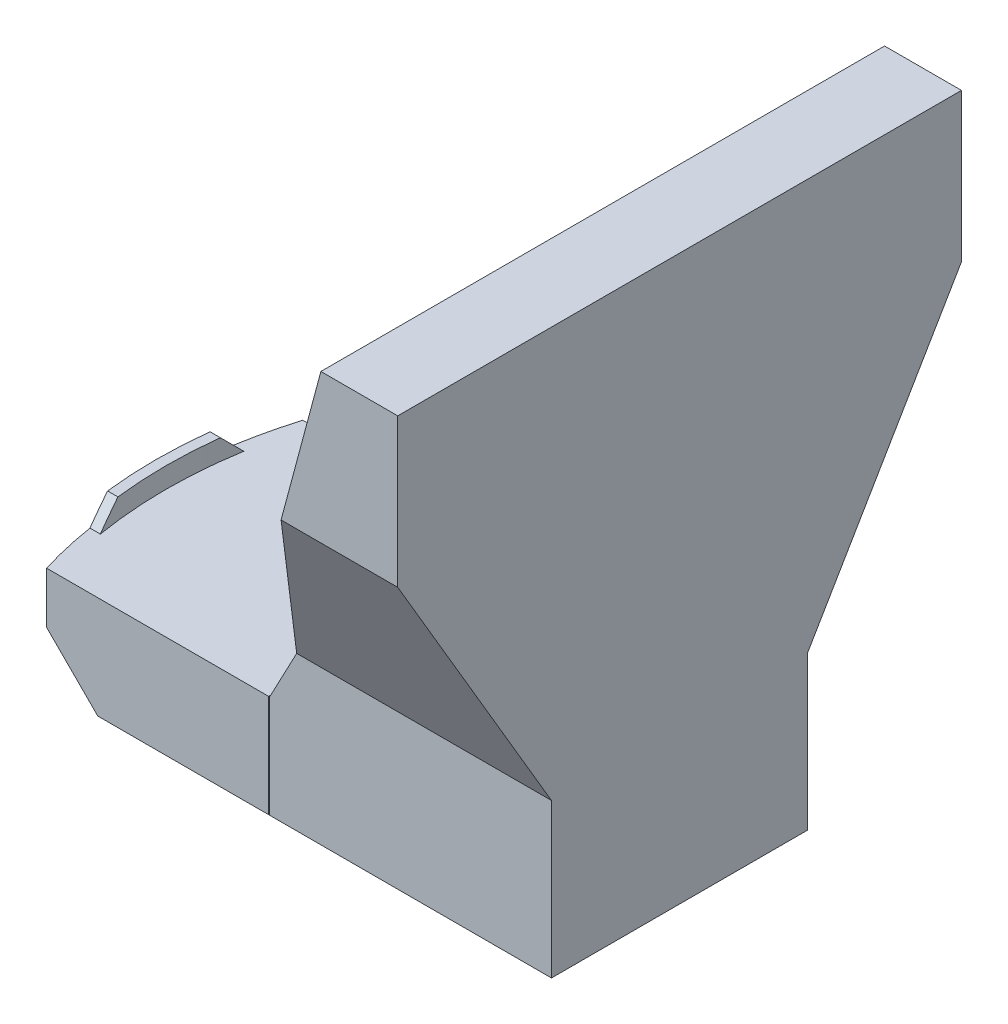
ISO-10303-21;
HEADER;
FILE_DESCRIPTION(('STEP AP214'),'2;1');
FILE_NAME('part.step','',(''),(''),'','','');
FILE_SCHEMA(('AUTOMOTIVE_DESIGN { 1 0 10303 214 1 1 1 1 }'));
ENDSEC;
DATA;
#1=APPLICATION_CONTEXT('core data for automotive mechanical design processes');
#2=APPLICATION_PROTOCOL_DEFINITION('international standard','automotive_design',2000,#1);
#3=PRODUCT_CONTEXT('',#1,'mechanical');
#4=PRODUCT('Part','Part','',(#3));
#5=PRODUCT_RELATED_PRODUCT_CATEGORY('part','',(#4));
#6=PRODUCT_DEFINITION_FORMATION('','',#4);
#7=PRODUCT_DEFINITION_CONTEXT('part definition',#1,'design');
#8=PRODUCT_DEFINITION('design','',#6,#7);
#9=PRODUCT_DEFINITION_SHAPE('','',#8);
#10=(LENGTH_UNIT() NAMED_UNIT(*) SI_UNIT(.MILLI.,.METRE.));
#11=(NAMED_UNIT(*) PLANE_ANGLE_UNIT() SI_UNIT($,.RADIAN.));
#12=(NAMED_UNIT(*) SI_UNIT($,.STERADIAN.) SOLID_ANGLE_UNIT());
#13=UNCERTAINTY_MEASURE_WITH_UNIT(LENGTH_MEASURE(1.E-05),#10,'distance_accuracy_value','');
#14=(GEOMETRIC_REPRESENTATION_CONTEXT(3) GLOBAL_UNCERTAINTY_ASSIGNED_CONTEXT((#13)) GLOBAL_UNIT_ASSIGNED_CONTEXT((#10,
#11,#12)) REPRESENTATION_CONTEXT('',''));
#15=CARTESIAN_POINT('',(0.,0.,0.));
#16=DIRECTION('',(0.,0.,1.));
#17=DIRECTION('',(1.,0.,0.));
#18=AXIS2_PLACEMENT_3D('',#15,#16,#17);
#19=CARTESIAN_POINT('',(78.0457127469454,110.,177.983738762488));
#20=DIRECTION('',(-1.,0.,0.));
#21=DIRECTION('',(0.,-1.,0.));
#22=AXIS2_PLACEMENT_3D('',#19,#20,#21);
#23=PLANE('',#22);
#24=DIRECTION('',(0.,1.,0.));
#25=VECTOR('',#24,1.);
#26=CARTESIAN_POINT('',(78.0457127469454,0.,-25.));
#27=LINE('',#26,#25);
#28=CARTESIAN_POINT('',(78.0457127469454,0.,-25.));
#29=VERTEX_POINT('',#28);
#30=CARTESIAN_POINT('',(78.0457127469454,30.,-25.));
#31=VERTEX_POINT('',#30);
#32=EDGE_CURVE('E119',#29,#31,#27,.T.);
#33=ORIENTED_EDGE('',*,*,#32,.T.);
#34=DIRECTION('',(0.,0.862030728946208,-0.50685601737818));
#35=VECTOR('',#34,1.);
#36=CARTESIAN_POINT('',(78.0457127469454,81.0222252113279,-55.));
#37=LINE('',#36,#35);
#38=CARTESIAN_POINT('',(78.0457127469454,81.0222252113279,-55.));
#39=VERTEX_POINT('',#38);
#40=EDGE_CURVE('E164',#31,#39,#37,.T.);
#41=ORIENTED_EDGE('',*,*,#40,.T.);
#42=DIRECTION('',(0.,-1.,0.));
#43=VECTOR('',#42,1.);
#44=CARTESIAN_POINT('',(78.0457127469454,110.,-55.));
#45=LINE('',#44,#43);
#46=CARTESIAN_POINT('',(78.0457127469454,110.,-55.));
#47=VERTEX_POINT('',#46);
#48=EDGE_CURVE('E172',#47,#39,#45,.T.);
#49=ORIENTED_EDGE('',*,*,#48,.F.);
#50=DIRECTION('',(0.,0.,-1.));
#51=VECTOR('',#50,1.);
#52=CARTESIAN_POINT('',(78.0457127469454,110.,177.983738762488));
#53=LINE('',#52,#51);
#54=CARTESIAN_POINT('',(78.0457127469454,110.,55.));
#55=VERTEX_POINT('',#54);
#56=EDGE_CURVE('E143',#55,#47,#53,.T.);
#57=ORIENTED_EDGE('',*,*,#56,.F.);
#58=DIRECTION('',(0.,-1.,0.));
#59=VECTOR('',#58,1.);
#60=CARTESIAN_POINT('',(78.0457127469454,110.,55.));
#61=LINE('',#60,#59);
#62=CARTESIAN_POINT('',(78.0457127469454,81.0222252113279,55.));
#63=VERTEX_POINT('',#62);
#64=EDGE_CURVE('E66',#55,#63,#61,.T.);
#65=ORIENTED_EDGE('',*,*,#64,.T.);
#66=DIRECTION('',(0.,0.862030728946208,0.50685601737818));
#67=VECTOR('',#66,1.);
#68=CARTESIAN_POINT('',(78.0457127469454,81.0222252113279,55.));
#69=LINE('',#68,#67);
#70=CARTESIAN_POINT('',(78.0457127469454,30.,25.));
#71=VERTEX_POINT('',#70);
#72=EDGE_CURVE('E59',#71,#63,#69,.T.);
#73=ORIENTED_EDGE('',*,*,#72,.F.);
#74=DIRECTION('',(0.,1.,0.));
#75=VECTOR('',#74,1.);
#76=CARTESIAN_POINT('',(78.0457127469454,0.,25.));
#77=LINE('',#76,#75);
#78=CARTESIAN_POINT('',(78.0457127469454,0.,25.));
#79=VERTEX_POINT('',#78);
#80=EDGE_CURVE('E193',#79,#71,#77,.T.);
#81=ORIENTED_EDGE('',*,*,#80,.F.);
#82=DIRECTION('',(0.,0.,-1.));
#83=VECTOR('',#82,1.);
#84=CARTESIAN_POINT('',(78.0457127469454,0.,177.983738762488));
#85=LINE('',#84,#83);
#86=EDGE_CURVE('E139',#79,#29,#85,.T.);
#87=ORIENTED_EDGE('',*,*,#86,.T.);
#88=EDGE_LOOP('',(#33,#41,#49,#57,#65,#73,#81,#87));
#89=FACE_BOUND('',#88,.T.);
#90=ADVANCED_FACE('F44',(#89),#23,.F.);
#91=CARTESIAN_POINT('',(78.0457127469454,0.,177.983738762488));
#92=DIRECTION('',(0.,1.,0.));
#93=DIRECTION('',(0.,0.,1.));
#94=AXIS2_PLACEMENT_3D('',#91,#92,#93);
#95=PLANE('',#94);
#96=DIRECTION('',(1.,0.,0.));
#97=VECTOR('',#96,1.);
#98=CARTESIAN_POINT('',(23.0457127469453,0.,-25.));
#99=LINE('',#98,#97);
#100=CARTESIAN_POINT('',(23.0457127469453,0.,-25.));
#101=VERTEX_POINT('',#100);
#102=EDGE_CURVE('E113',#101,#29,#99,.T.);
#103=ORIENTED_EDGE('',*,*,#102,.T.);
#104=ORIENTED_EDGE('',*,*,#86,.F.);
#105=DIRECTION('',(1.,0.,0.));
#106=VECTOR('',#105,1.);
#107=CARTESIAN_POINT('',(-24.1514294287429,0.,25.));
#108=LINE('',#107,#106);
#109=CARTESIAN_POINT('',(23.0457127469453,0.,25.));
#110=VERTEX_POINT('',#109);
#111=EDGE_CURVE('E138',#110,#79,#108,.T.);
#112=ORIENTED_EDGE('',*,*,#111,.F.);
#113=DIRECTION('',(0.,0.,-1.));
#114=VECTOR('',#113,1.);
#115=CARTESIAN_POINT('',(23.0457127469453,0.,177.983738762488));
#116=LINE('',#115,#114);
#117=EDGE_CURVE('E132',#110,#101,#116,.T.);
#118=ORIENTED_EDGE('',*,*,#117,.T.);
#119=EDGE_LOOP('',(#103,#104,#112,#118));
#120=FACE_BOUND('',#119,.T.);
#121=ADVANCED_FACE('F137',(#120),#95,.F.);
#122=CARTESIAN_POINT('',(23.0457127469453,20.,177.983738762488));
#123=DIRECTION('',(1.,0.,0.));
#124=DIRECTION('',(0.,1.,0.));
#125=AXIS2_PLACEMENT_3D('',#122,#123,#124);
#126=PLANE('',#125);
#127=DIRECTION('',(0.,1.,0.));
#128=VECTOR('',#127,1.);
#129=CARTESIAN_POINT('',(23.0457127469453,0.,-25.));
#130=LINE('',#129,#128);
#131=CARTESIAN_POINT('',(23.0457127469453,20.,-25.));
#132=VERTEX_POINT('',#131);
#133=EDGE_CURVE('E116',#101,#132,#130,.T.);
#134=ORIENTED_EDGE('',*,*,#133,.F.);
#135=ORIENTED_EDGE('',*,*,#117,.F.);
#136=DIRECTION('',(0.,1.,0.));
#137=VECTOR('',#136,1.);
#138=CARTESIAN_POINT('',(23.0457127469453,20.,25.));
#139=LINE('',#138,#137);
#140=CARTESIAN_POINT('',(23.0457127469453,20.,25.));
#141=VERTEX_POINT('',#140);
#142=EDGE_CURVE('E178',#110,#141,#139,.T.);
#143=ORIENTED_EDGE('',*,*,#142,.T.);
#144=DIRECTION('',(0.,0.,-1.));
#145=VECTOR('',#144,1.);
#146=CARTESIAN_POINT('',(23.0457127469453,20.,177.983738762488));
#147=LINE('',#146,#145);
#148=EDGE_CURVE('E134',#141,#132,#147,.T.);
#149=ORIENTED_EDGE('',*,*,#148,.T.);
#150=EDGE_LOOP('',(#134,#135,#143,#149));
#151=FACE_BOUND('',#150,.T.);
#152=ADVANCED_FACE('F130',(#151),#126,.F.);
#153=CARTESIAN_POINT('',(55.28114139387,81.0222252113279,177.983738762488));
#154=DIRECTION('',(0.884209710262989,-0.46709012864397,0.));
#155=DIRECTION('',(0.46709012864397,0.884209710262989,0.));
#156=AXIS2_PLACEMENT_3D('',#153,#154,#155);
#157=PLANE('',#156);
#158=DIRECTION('',(0.46709012864397,0.884209710262989,0.));
#159=VECTOR('',#158,1.);
#160=CARTESIAN_POINT('',(55.28114139387,81.0222252113279,-25.));
#161=LINE('',#160,#159);
#162=CARTESIAN_POINT('',(28.3282845534124,30.,-25.));
#163=VERTEX_POINT('',#162);
#164=EDGE_CURVE('E12',#132,#163,#161,.T.);
#165=ORIENTED_EDGE('',*,*,#164,.F.);
#166=ORIENTED_EDGE('',*,*,#148,.F.);
#167=DIRECTION('',(0.46709012864397,0.884209710262989,0.));
#168=VECTOR('',#167,1.);
#169=CARTESIAN_POINT('',(55.28114139387,81.0222252113279,25.));
#170=LINE('',#169,#168);
#171=CARTESIAN_POINT('',(28.3282845534124,30.,25.));
#172=VERTEX_POINT('',#171);
#173=EDGE_CURVE('E155',#141,#172,#170,.T.);
#174=ORIENTED_EDGE('',*,*,#173,.T.);
#175=DIRECTION('',(0.414427715659653,0.784518849610899,0.461280655456431));
#176=VECTOR('',#175,1.);
#177=CARTESIAN_POINT('',(78.7916338371498,125.527994947383,81.1684606375263));
#178=LINE('',#177,#176);
#179=CARTESIAN_POINT('',(55.2811413938699,81.0222252113279,55.));
#180=VERTEX_POINT('',#179);
#181=EDGE_CURVE('E182',#172,#180,#178,.T.);
#182=ORIENTED_EDGE('',*,*,#181,.T.);
#183=DIRECTION('',(0.,0.,-1.));
#184=VECTOR('',#183,1.);
#185=CARTESIAN_POINT('',(55.28114139387,81.0222252113279,177.983738762488));
#186=LINE('',#185,#184);
#187=CARTESIAN_POINT('',(55.28114139387,81.0222252113279,-55.));
#188=VERTEX_POINT('',#187);
#189=EDGE_CURVE('E141',#180,#188,#186,.T.);
#190=ORIENTED_EDGE('',*,*,#189,.T.);
#191=DIRECTION('',(0.414427715659653,0.784518849610899,-0.461280655456431));
#192=VECTOR('',#191,1.);
#193=CARTESIAN_POINT('',(10.7422252355226,-3.2907151330351,-5.42575662165906));
#194=LINE('',#193,#192);
#195=EDGE_CURVE('E124',#163,#188,#194,.T.);
#196=ORIENTED_EDGE('',*,*,#195,.F.);
#197=EDGE_LOOP('',(#165,#166,#174,#182,#190,#196));
#198=FACE_BOUND('',#197,.T.);
#199=ADVANCED_FACE('F203',(#198),#157,.F.);
#200=CARTESIAN_POINT('',(62.8485705712571,110.,-55.));
#201=DIRECTION('',(0.,0.,1.));
#202=DIRECTION('',(1.,0.,0.));
#203=AXIS2_PLACEMENT_3D('',#200,#201,#202);
#204=PLANE('',#203);
#205=DIRECTION('',(1.,0.,0.));
#206=VECTOR('',#205,1.);
#207=CARTESIAN_POINT('',(62.8485705712571,81.022225211328,-55.));
#208=LINE('',#207,#206);
#209=EDGE_CURVE('E52',#188,#39,#208,.T.);
#210=ORIENTED_EDGE('',*,*,#209,.F.);
#211=DIRECTION('',(0.258819045102514,0.96592582628907,0.));
#212=VECTOR('',#211,1.);
#213=CARTESIAN_POINT('',(63.0457127469454,110.,-55.));
#214=LINE('',#213,#212);
#215=CARTESIAN_POINT('',(63.0457127469454,110.,-55.));
#216=VERTEX_POINT('',#215);
#217=EDGE_CURVE('E180',#188,#216,#214,.T.);
#218=ORIENTED_EDGE('',*,*,#217,.T.);
#219=DIRECTION('',(1.,0.,0.));
#220=VECTOR('',#219,1.);
#221=CARTESIAN_POINT('',(78.0457127469454,110.,-55.));
#222=LINE('',#221,#220);
#223=EDGE_CURVE('E177',#216,#47,#222,.T.);
#224=ORIENTED_EDGE('',*,*,#223,.T.);
#225=ORIENTED_EDGE('',*,*,#48,.T.);
#226=EDGE_LOOP('',(#210,#218,#224,#225));
#227=FACE_BOUND('',#226,.T.);
#228=ADVANCED_FACE('F175',(#227),#204,.F.);
#229=CARTESIAN_POINT('',(63.0457127469454,110.,177.983738762488));
#230=DIRECTION('',(0.96592582628907,-0.258819045102514,0.));
#231=DIRECTION('',(0.258819045102514,0.96592582628907,0.));
#232=AXIS2_PLACEMENT_3D('',#229,#230,#231);
#233=PLANE('',#232);
#234=ORIENTED_EDGE('',*,*,#189,.F.);
#235=DIRECTION('',(0.258819045102514,0.96592582628907,0.));
#236=VECTOR('',#235,1.);
#237=CARTESIAN_POINT('',(63.0457127469454,110.,55.));
#238=LINE('',#237,#236);
#239=CARTESIAN_POINT('',(63.0457127469454,110.,55.));
#240=VERTEX_POINT('',#239);
#241=EDGE_CURVE('E152',#180,#240,#238,.T.);
#242=ORIENTED_EDGE('',*,*,#241,.T.);
#243=DIRECTION('',(0.,0.,-1.));
#244=VECTOR('',#243,1.);
#245=CARTESIAN_POINT('',(63.0457127469454,110.,177.983738762488));
#246=LINE('',#245,#244);
#247=EDGE_CURVE('E149',#240,#216,#246,.T.);
#248=ORIENTED_EDGE('',*,*,#247,.T.);
#249=ORIENTED_EDGE('',*,*,#217,.F.);
#250=EDGE_LOOP('',(#234,#242,#248,#249));
#251=FACE_BOUND('',#250,.T.);
#252=ADVANCED_FACE('F209',(#251),#233,.F.);
#253=CARTESIAN_POINT('',(78.0457127469454,110.,177.983738762488));
#254=DIRECTION('',(0.,-1.,0.));
#255=DIRECTION('',(0.,0.,-1.));
#256=AXIS2_PLACEMENT_3D('',#253,#254,#255);
#257=PLANE('',#256);
#258=ORIENTED_EDGE('',*,*,#247,.F.);
#259=DIRECTION('',(1.,0.,0.));
#260=VECTOR('',#259,1.);
#261=CARTESIAN_POINT('',(78.0457127469454,110.,55.));
#262=LINE('',#261,#260);
#263=EDGE_CURVE('E156',#240,#55,#262,.T.);
#264=ORIENTED_EDGE('',*,*,#263,.T.);
#265=ORIENTED_EDGE('',*,*,#56,.T.);
#266=ORIENTED_EDGE('',*,*,#223,.F.);
#267=EDGE_LOOP('',(#258,#264,#265,#266));
#268=FACE_BOUND('',#267,.T.);
#269=ADVANCED_FACE('F46',(#268),#257,.F.);
#270=CARTESIAN_POINT('',(62.8485705712571,110.,55.));
#271=DIRECTION('',(0.,0.,-1.));
#272=DIRECTION('',(-1.,0.,0.));
#273=AXIS2_PLACEMENT_3D('',#270,#271,#272);
#274=PLANE('',#273);
#275=ORIENTED_EDGE('',*,*,#241,.F.);
#276=DIRECTION('',(1.,0.,0.));
#277=VECTOR('',#276,1.);
#278=CARTESIAN_POINT('',(62.8485705712571,81.0222252113279,55.));
#279=LINE('',#278,#277);
#280=EDGE_CURVE('E153',#180,#63,#279,.T.);
#281=ORIENTED_EDGE('',*,*,#280,.T.);
#282=ORIENTED_EDGE('',*,*,#64,.F.);
#283=ORIENTED_EDGE('',*,*,#263,.F.);
#284=EDGE_LOOP('',(#275,#281,#282,#283));
#285=FACE_BOUND('',#284,.T.);
#286=ADVANCED_FACE('F207',(#285),#274,.F.);
#287=CARTESIAN_POINT('',(-24.1514294287429,0.,25.));
#288=DIRECTION('',(0.,0.,-1.));
#289=DIRECTION('',(-1.,0.,0.));
#290=AXIS2_PLACEMENT_3D('',#287,#288,#289);
#291=PLANE('',#290);
#292=ORIENTED_EDGE('',*,*,#111,.T.);
#293=ORIENTED_EDGE('',*,*,#80,.T.);
#294=DIRECTION('',(1.,0.,0.));
#295=VECTOR('',#294,1.);
#296=CARTESIAN_POINT('',(-24.1514294287429,30.,25.));
#297=LINE('',#296,#295);
#298=EDGE_CURVE('E195',#172,#71,#297,.T.);
#299=ORIENTED_EDGE('',*,*,#298,.F.);
#300=ORIENTED_EDGE('',*,*,#173,.F.);
#301=ORIENTED_EDGE('',*,*,#142,.F.);
#302=EDGE_LOOP('',(#292,#293,#299,#300,#301));
#303=FACE_BOUND('',#302,.T.);
#304=ADVANCED_FACE('F266',(#303),#291,.F.);
#305=CARTESIAN_POINT('',(-24.1514294287429,81.0222252113279,55.));
#306=DIRECTION('',(0.,0.50685601737818,-0.862030728946208));
#307=DIRECTION('',(0.,0.862030728946208,0.50685601737818));
#308=AXIS2_PLACEMENT_3D('',#305,#306,#307);
#309=PLANE('',#308);
#310=ORIENTED_EDGE('',*,*,#298,.T.);
#311=ORIENTED_EDGE('',*,*,#72,.T.);
#312=ORIENTED_EDGE('',*,*,#280,.F.);
#313=ORIENTED_EDGE('',*,*,#181,.F.);
#314=EDGE_LOOP('',(#310,#311,#312,#313));
#315=FACE_BOUND('',#314,.T.);
#316=ADVANCED_FACE('F250',(#315),#309,.F.);
#317=CARTESIAN_POINT('',(23.0457127469453,0.,-25.));
#318=DIRECTION('',(0.,0.,-1.));
#319=DIRECTION('',(-1.,0.,0.));
#320=AXIS2_PLACEMENT_3D('',#317,#318,#319);
#321=PLANE('',#320);
#322=ORIENTED_EDGE('',*,*,#164,.T.);
#323=DIRECTION('',(1.,0.,0.));
#324=VECTOR('',#323,1.);
#325=CARTESIAN_POINT('',(23.0457127469453,30.,-25.));
#326=LINE('',#325,#324);
#327=EDGE_CURVE('E125',#163,#31,#326,.T.);
#328=ORIENTED_EDGE('',*,*,#327,.T.);
#329=ORIENTED_EDGE('',*,*,#32,.F.);
#330=ORIENTED_EDGE('',*,*,#102,.F.);
#331=ORIENTED_EDGE('',*,*,#133,.T.);
#332=EDGE_LOOP('',(#322,#328,#329,#330,#331));
#333=FACE_BOUND('',#332,.T.);
#334=ADVANCED_FACE('F115',(#333),#321,.T.);
#335=CARTESIAN_POINT('',(23.0457127469453,81.0222252113279,-55.));
#336=DIRECTION('',(0.,-0.50685601737818,-0.862030728946208));
#337=DIRECTION('',(0.,0.862030728946208,-0.50685601737818));
#338=AXIS2_PLACEMENT_3D('',#335,#336,#337);
#339=PLANE('',#338);
#340=ORIENTED_EDGE('',*,*,#195,.T.);
#341=ORIENTED_EDGE('',*,*,#209,.T.);
#342=ORIENTED_EDGE('',*,*,#40,.F.);
#343=ORIENTED_EDGE('',*,*,#327,.F.);
#344=EDGE_LOOP('',(#340,#341,#342,#343));
#345=FACE_BOUND('',#344,.T.);
#346=ADVANCED_FACE('F162',(#345),#339,.T.);
#347=CLOSED_SHELL('',(#90,#121,#152,#199,#228,#252,#269,#286,#304,#316,#334,#346));
#348=MANIFOLD_SOLID_BREP('B2',#347);
#349=CARTESIAN_POINT('',(22.8485705712571,20.,-25.));
#350=DIRECTION('',(0.,0.,1.));
#351=DIRECTION('',(1.,0.,0.));
#352=AXIS2_PLACEMENT_3D('',#349,#350,#351);
#353=PLANE('',#352);
#354=DIRECTION('',(-1.,0.,0.));
#355=VECTOR('',#354,1.);
#356=CARTESIAN_POINT('',(22.8485705712571,0.,-25.));
#357=LINE('',#356,#355);
#358=CARTESIAN_POINT('',(22.8485705712571,0.,-25.));
#359=VERTEX_POINT('',#358);
#360=CARTESIAN_POINT('',(-10.4820960527415,0.,-25.));
#361=VERTEX_POINT('',#360);
#362=EDGE_CURVE('E424',#359,#361,#357,.T.);
#363=ORIENTED_EDGE('',*,*,#362,.T.);
#364=DIRECTION('',(-0.707106781186551,0.707106781186544,0.));
#365=VECTOR('',#364,1.);
#366=CARTESIAN_POINT('',(-10.4820960527415,0.,-25.));
#367=LINE('',#366,#365);
#368=CARTESIAN_POINT('',(-20.4820960527415,9.99999999999988,-25.));
#369=VERTEX_POINT('',#368);
#370=EDGE_CURVE('E414',#361,#369,#367,.T.);
#371=ORIENTED_EDGE('',*,*,#370,.T.);
#372=DIRECTION('',(0.,-1.,0.));
#373=VECTOR('',#372,1.);
#374=CARTESIAN_POINT('',(-20.4820960527415,20.,-25.));
#375=LINE('',#374,#373);
#376=CARTESIAN_POINT('',(-20.4820960527415,20.,-25.));
#377=VERTEX_POINT('',#376);
#378=EDGE_CURVE('E444',#377,#369,#375,.T.);
#379=ORIENTED_EDGE('',*,*,#378,.F.);
#380=DIRECTION('',(-1.,0.,0.));
#381=VECTOR('',#380,1.);
#382=CARTESIAN_POINT('',(22.8485705712571,20.,-25.));
#383=LINE('',#382,#381);
#384=CARTESIAN_POINT('',(22.8485705712571,20.,-25.));
#385=VERTEX_POINT('',#384);
#386=EDGE_CURVE('E398',#385,#377,#383,.T.);
#387=ORIENTED_EDGE('',*,*,#386,.F.);
#388=DIRECTION('',(0.,-1.,0.));
#389=VECTOR('',#388,1.);
#390=CARTESIAN_POINT('',(22.8485705712571,20.,-25.));
#391=LINE('',#390,#389);
#392=EDGE_CURVE('E430',#385,#359,#391,.T.);
#393=ORIENTED_EDGE('',*,*,#392,.T.);
#394=EDGE_LOOP('',(#363,#371,#379,#387,#393));
#395=FACE_BOUND('',#394,.T.);
#396=ADVANCED_FACE('F314',(#395),#353,.F.);
#397=CARTESIAN_POINT('',(62.8485705712571,20.,0.));
#398=DIRECTION('',(0.,-1.,0.));
#399=DIRECTION('',(0.,0.,-1.));
#400=AXIS2_PLACEMENT_3D('',#397,#398,#399);
#401=CYLINDRICAL_SURFACE('',#400,87.);
#402=CARTESIAN_POINT('',(62.8485705712571,24.,0.));
#403=DIRECTION('',(0.,1.,0.));
#404=DIRECTION('',(0.,0.,1.));
#405=AXIS2_PLACEMENT_3D('',#402,#403,#404);
#406=CIRCLE('',#405,87.);
#407=CARTESIAN_POINT('',(-23.5748058959928,24.,-10.));
#408=VERTEX_POINT('',#407);
#409=CARTESIAN_POINT('',(-23.5748058959928,24.,10.));
#410=VERTEX_POINT('',#409);
#411=EDGE_CURVE('E390',#408,#410,#406,.T.);
#412=ORIENTED_EDGE('',*,*,#411,.F.);
#413=CARTESIAN_POINT('',(62.8485705712571,34.,0.));
#414=DIRECTION('',(0.,0.707106781186546,-0.707106781186549));
#415=DIRECTION('',(0.,-0.707106781186549,-0.707106781186546));
#416=AXIS2_PLACEMENT_3D('',#413,#414,#415);
#417=ELLIPSE('',#416,123.03657992646,87.);
#418=CARTESIAN_POINT('',(-23.0176043755751,20.,-14.));
#419=VERTEX_POINT('',#418);
#420=EDGE_CURVE('E338',#408,#419,#417,.F.);
#421=ORIENTED_EDGE('',*,*,#420,.T.);
#422=CARTESIAN_POINT('',(62.8485705712571,20.,0.));
#423=DIRECTION('',(0.,1.,0.));
#424=DIRECTION('',(0.,0.,1.));
#425=AXIS2_PLACEMENT_3D('',#422,#423,#424);
#426=CIRCLE('',#425,87.);
#427=EDGE_CURVE('E388',#377,#419,#426,.T.);
#428=ORIENTED_EDGE('',*,*,#427,.F.);
#429=ORIENTED_EDGE('',*,*,#378,.T.);
#430=CARTESIAN_POINT('',(62.8485705712571,-73.3306666239979,0.));
#431=DIRECTION('',(0.707106781186544,0.707106781186551,0.));
#432=DIRECTION('',(0.707106781186551,-0.707106781186544,0.));
#433=AXIS2_PLACEMENT_3D('',#430,#431,#432);
#434=ELLIPSE('',#433,123.036579926459,87.);
#435=CARTESIAN_POINT('',(-20.4820960527415,9.99999999999989,25.));
#436=VERTEX_POINT('',#435);
#437=EDGE_CURVE('E421',#369,#436,#434,.T.);
#438=ORIENTED_EDGE('',*,*,#437,.T.);
#439=DIRECTION('',(0.,-1.,0.));
#440=VECTOR('',#439,1.);
#441=CARTESIAN_POINT('',(-20.4820960527415,20.,25.));
#442=LINE('',#441,#440);
#443=CARTESIAN_POINT('',(-20.4820960527415,20.,25.));
#444=VERTEX_POINT('',#443);
#445=EDGE_CURVE('E441',#444,#436,#442,.T.);
#446=ORIENTED_EDGE('',*,*,#445,.F.);
#447=CARTESIAN_POINT('',(-23.0176043755751,20.,14.));
#448=VERTEX_POINT('',#447);
#449=EDGE_CURVE('E401',#448,#444,#426,.T.);
#450=ORIENTED_EDGE('',*,*,#449,.F.);
#451=CARTESIAN_POINT('',(62.8485705712571,34.,0.));
#452=DIRECTION('',(0.,0.707106781186546,0.707106781186549));
#453=DIRECTION('',(0.,-0.707106781186549,0.707106781186546));
#454=AXIS2_PLACEMENT_3D('',#451,#452,#453);
#455=ELLIPSE('',#454,123.03657992646,87.);
#456=EDGE_CURVE('E330',#448,#410,#455,.F.);
#457=ORIENTED_EDGE('',*,*,#456,.T.);
#458=EDGE_LOOP('',(#412,#421,#428,#429,#438,#446,#450,#457));
#459=FACE_BOUND('',#458,.T.);
#460=ADVANCED_FACE('F386',(#459),#401,.T.);
#461=CARTESIAN_POINT('',(-20.4820960527415,20.,25.));
#462=DIRECTION('',(0.,0.,-1.));
#463=DIRECTION('',(-1.,0.,0.));
#464=AXIS2_PLACEMENT_3D('',#461,#462,#463);
#465=PLANE('',#464);
#466=ORIENTED_EDGE('',*,*,#445,.T.);
#467=DIRECTION('',(-0.707106781186551,0.707106781186544,0.));
#468=VECTOR('',#467,1.);
#469=CARTESIAN_POINT('',(-10.4820960527415,0.,25.));
#470=LINE('',#469,#468);
#471=CARTESIAN_POINT('',(-10.4820960527415,0.,25.));
#472=VERTEX_POINT('',#471);
#473=EDGE_CURVE('E418',#472,#436,#470,.T.);
#474=ORIENTED_EDGE('',*,*,#473,.F.);
#475=DIRECTION('',(1.,0.,0.));
#476=VECTOR('',#475,1.);
#477=CARTESIAN_POINT('',(-20.4820960527415,0.,25.));
#478=LINE('',#477,#476);
#479=CARTESIAN_POINT('',(22.8485705712571,0.,25.));
#480=VERTEX_POINT('',#479);
#481=EDGE_CURVE('E433',#472,#480,#478,.T.);
#482=ORIENTED_EDGE('',*,*,#481,.T.);
#483=DIRECTION('',(0.,-1.,0.));
#484=VECTOR('',#483,1.);
#485=CARTESIAN_POINT('',(22.8485705712571,20.,25.));
#486=LINE('',#485,#484);
#487=CARTESIAN_POINT('',(22.8485705712571,20.,25.));
#488=VERTEX_POINT('',#487);
#489=EDGE_CURVE('E438',#488,#480,#486,.T.);
#490=ORIENTED_EDGE('',*,*,#489,.F.);
#491=DIRECTION('',(1.,0.,0.));
#492=VECTOR('',#491,1.);
#493=CARTESIAN_POINT('',(-20.4820960527415,20.,25.));
#494=LINE('',#493,#492);
#495=EDGE_CURVE('E400',#444,#488,#494,.T.);
#496=ORIENTED_EDGE('',*,*,#495,.F.);
#497=EDGE_LOOP('',(#466,#474,#482,#490,#496));
#498=FACE_BOUND('',#497,.T.);
#499=ADVANCED_FACE('F474',(#498),#465,.F.);
#500=CARTESIAN_POINT('',(22.8485705712571,20.,15.));
#501=DIRECTION('',(-1.,0.,0.));
#502=DIRECTION('',(0.,0.,1.));
#503=AXIS2_PLACEMENT_3D('',#500,#501,#502);
#504=PLANE('',#503);
#505=DIRECTION('',(0.,0.,-1.));
#506=VECTOR('',#505,1.);
#507=CARTESIAN_POINT('',(22.8485705712571,0.,15.));
#508=LINE('',#507,#506);
#509=EDGE_CURVE('E425',#480,#359,#508,.T.);
#510=ORIENTED_EDGE('',*,*,#509,.T.);
#511=ORIENTED_EDGE('',*,*,#392,.F.);
#512=DIRECTION('',(0.,0.,-1.));
#513=VECTOR('',#512,1.);
#514=CARTESIAN_POINT('',(22.8485705712571,20.,25.));
#515=LINE('',#514,#513);
#516=EDGE_CURVE('E428',#488,#385,#515,.T.);
#517=ORIENTED_EDGE('',*,*,#516,.F.);
#518=ORIENTED_EDGE('',*,*,#489,.T.);
#519=EDGE_LOOP('',(#510,#511,#517,#518));
#520=FACE_BOUND('',#519,.T.);
#521=ADVANCED_FACE('F484',(#520),#504,.F.);
#522=CARTESIAN_POINT('',(62.8485705712571,20.,0.));
#523=DIRECTION('',(0.,1.,0.));
#524=DIRECTION('',(0.,0.,1.));
#525=AXIS2_PLACEMENT_3D('',#522,#523,#524);
#526=PLANE('',#525);
#527=DIRECTION('',(1.,0.,0.));
#528=VECTOR('',#527,1.);
#529=CARTESIAN_POINT('',(-23.0176043755751,20.,14.));
#530=LINE('',#529,#528);
#531=CARTESIAN_POINT('',(-20.9905611036356,20.,14.));
#532=VERTEX_POINT('',#531);
#533=EDGE_CURVE('E405',#448,#532,#530,.T.);
#534=ORIENTED_EDGE('',*,*,#533,.F.);
#535=ORIENTED_EDGE('',*,*,#449,.T.);
#536=ORIENTED_EDGE('',*,*,#495,.T.);
#537=ORIENTED_EDGE('',*,*,#516,.T.);
#538=ORIENTED_EDGE('',*,*,#386,.T.);
#539=ORIENTED_EDGE('',*,*,#427,.T.);
#540=DIRECTION('',(-1.,0.,0.));
#541=VECTOR('',#540,1.);
#542=CARTESIAN_POINT('',(-23.0176043755751,20.,-14.));
#543=LINE('',#542,#541);
#544=CARTESIAN_POINT('',(-20.9905611036356,20.,-14.));
#545=VERTEX_POINT('',#544);
#546=EDGE_CURVE('E395',#545,#419,#543,.T.);
#547=ORIENTED_EDGE('',*,*,#546,.F.);
#548=CARTESIAN_POINT('',(62.8485705712571,20.,0.));
#549=DIRECTION('',(0.,-1.,0.));
#550=DIRECTION('',(0.,0.,1.));
#551=AXIS2_PLACEMENT_3D('',#548,#549,#550);
#552=CIRCLE('',#551,85.);
#553=EDGE_CURVE('E406',#532,#545,#552,.T.);
#554=ORIENTED_EDGE('',*,*,#553,.F.);
#555=EDGE_LOOP('',(#534,#535,#536,#537,#538,#539,#547,#554));
#556=FACE_BOUND('',#555,.T.);
#557=ADVANCED_FACE('F393',(#556),#526,.T.);
#558=CARTESIAN_POINT('',(62.8485705712571,0.,0.));
#559=DIRECTION('',(0.,1.,0.));
#560=DIRECTION('',(0.,0.,1.));
#561=AXIS2_PLACEMENT_3D('',#558,#559,#560);
#562=PLANE('',#561);
#563=ORIENTED_EDGE('',*,*,#481,.F.);
#564=DIRECTION('',(0.,0.,1.));
#565=VECTOR('',#564,1.);
#566=CARTESIAN_POINT('',(-10.4820960527415,0.,-25.));
#567=LINE('',#566,#565);
#568=EDGE_CURVE('E417',#361,#472,#567,.T.);
#569=ORIENTED_EDGE('',*,*,#568,.F.);
#570=ORIENTED_EDGE('',*,*,#362,.F.);
#571=ORIENTED_EDGE('',*,*,#509,.F.);
#572=EDGE_LOOP('',(#563,#569,#570,#571));
#573=FACE_BOUND('',#572,.T.);
#574=ADVANCED_FACE('F489',(#573),#562,.F.);
#575=CARTESIAN_POINT('',(-10.4820960527415,0.,-25.));
#576=DIRECTION('',(0.707106781186544,0.707106781186551,0.));
#577=DIRECTION('',(-0.707106781186551,0.707106781186544,0.));
#578=AXIS2_PLACEMENT_3D('',#575,#576,#577);
#579=PLANE('',#578);
#580=ORIENTED_EDGE('',*,*,#370,.F.);
#581=ORIENTED_EDGE('',*,*,#568,.T.);
#582=ORIENTED_EDGE('',*,*,#473,.T.);
#583=ORIENTED_EDGE('',*,*,#437,.F.);
#584=EDGE_LOOP('',(#580,#581,#582,#583));
#585=FACE_BOUND('',#584,.T.);
#586=ADVANCED_FACE('F466',(#585),#579,.F.);
#587=CARTESIAN_POINT('',(62.8485705712571,24.,0.));
#588=DIRECTION('',(0.,-1.,0.));
#589=DIRECTION('',(0.,0.,-1.));
#590=AXIS2_PLACEMENT_3D('',#587,#588,#589);
#591=CYLINDRICAL_SURFACE('',#590,85.);
#592=ORIENTED_EDGE('',*,*,#553,.T.);
#593=CARTESIAN_POINT('',(62.8485705712571,34.,0.));
#594=DIRECTION('',(0.,0.707106781186546,-0.707106781186549));
#595=DIRECTION('',(0.,-0.707106781186549,-0.707106781186546));
#596=AXIS2_PLACEMENT_3D('',#593,#594,#595);
#597=ELLIPSE('',#596,120.208152801713,85.);
#598=CARTESIAN_POINT('',(-21.5611445094136,24.,-10.));
#599=VERTEX_POINT('',#598);
#600=EDGE_CURVE('E42',#545,#599,#597,.T.);
#601=ORIENTED_EDGE('',*,*,#600,.T.);
#602=CARTESIAN_POINT('',(62.8485705712571,24.,0.));
#603=DIRECTION('',(0.,-1.,0.));
#604=DIRECTION('',(0.,0.,1.));
#605=AXIS2_PLACEMENT_3D('',#602,#603,#604);
#606=CIRCLE('',#605,85.);
#607=CARTESIAN_POINT('',(-21.5611445094136,24.,10.));
#608=VERTEX_POINT('',#607);
#609=EDGE_CURVE('E409',#608,#599,#606,.T.);
#610=ORIENTED_EDGE('',*,*,#609,.F.);
#611=CARTESIAN_POINT('',(62.8485705712571,34.,0.));
#612=DIRECTION('',(0.,0.707106781186546,0.707106781186549));
#613=DIRECTION('',(0.,-0.707106781186549,0.707106781186546));
#614=AXIS2_PLACEMENT_3D('',#611,#612,#613);
#615=ELLIPSE('',#614,120.208152801713,85.);
#616=EDGE_CURVE('E323',#608,#532,#615,.T.);
#617=ORIENTED_EDGE('',*,*,#616,.T.);
#618=EDGE_LOOP('',(#592,#601,#610,#617));
#619=FACE_BOUND('',#618,.T.);
#620=ADVANCED_FACE('F453',(#619),#591,.F.);
#621=CARTESIAN_POINT('',(62.8485705712571,24.,0.));
#622=DIRECTION('',(0.,1.,0.));
#623=DIRECTION('',(0.,0.,1.));
#624=AXIS2_PLACEMENT_3D('',#621,#622,#623);
#625=PLANE('',#624);
#626=ORIENTED_EDGE('',*,*,#609,.T.);
#627=DIRECTION('',(-1.,0.,0.));
#628=VECTOR('',#627,1.);
#629=CARTESIAN_POINT('',(-23.0176043755751,24.,-10.));
#630=LINE('',#629,#628);
#631=EDGE_CURVE('E449',#599,#408,#630,.T.);
#632=ORIENTED_EDGE('',*,*,#631,.T.);
#633=ORIENTED_EDGE('',*,*,#411,.T.);
#634=DIRECTION('',(1.,0.,0.));
#635=VECTOR('',#634,1.);
#636=CARTESIAN_POINT('',(-20.9905611036356,24.,10.));
#637=LINE('',#636,#635);
#638=EDGE_CURVE('E446',#410,#608,#637,.T.);
#639=ORIENTED_EDGE('',*,*,#638,.T.);
#640=EDGE_LOOP('',(#626,#632,#633,#639));
#641=FACE_BOUND('',#640,.T.);
#642=ADVANCED_FACE('F458',(#641),#625,.T.);
#643=CARTESIAN_POINT('',(62.8485705712571,24.,-10.));
#644=DIRECTION('',(0.,0.707106781186546,-0.707106781186549));
#645=DIRECTION('',(1.,0.,0.));
#646=AXIS2_PLACEMENT_3D('',#643,#644,#645);
#647=PLANE('',#646);
#648=ORIENTED_EDGE('',*,*,#600,.F.);
#649=ORIENTED_EDGE('',*,*,#546,.T.);
#650=ORIENTED_EDGE('',*,*,#420,.F.);
#651=ORIENTED_EDGE('',*,*,#631,.F.);
#652=EDGE_LOOP('',(#648,#649,#650,#651));
#653=FACE_BOUND('',#652,.T.);
#654=ADVANCED_FACE('F404',(#653),#647,.T.);
#655=CARTESIAN_POINT('',(62.8485705712571,24.,10.));
#656=DIRECTION('',(0.,0.707106781186546,0.707106781186549));
#657=DIRECTION('',(-1.,0.,0.));
#658=AXIS2_PLACEMENT_3D('',#655,#656,#657);
#659=PLANE('',#658);
#660=ORIENTED_EDGE('',*,*,#456,.F.);
#661=ORIENTED_EDGE('',*,*,#533,.T.);
#662=ORIENTED_EDGE('',*,*,#616,.F.);
#663=ORIENTED_EDGE('',*,*,#638,.F.);
#664=EDGE_LOOP('',(#660,#661,#662,#663));
#665=FACE_BOUND('',#664,.T.);
#666=ADVANCED_FACE('F317',(#665),#659,.T.);
#667=CLOSED_SHELL('',(#396,#460,#499,#521,#557,#574,#586,#620,#642,#654,#666));
#668=MANIFOLD_SOLID_BREP('B6',#667);
#669=ADVANCED_BREP_SHAPE_REPRESENTATION('',(#18,#348,#668),#14);
#670=SHAPE_DEFINITION_REPRESENTATION(#9,#669);
ENDSEC;
END-ISO-10303-21;
